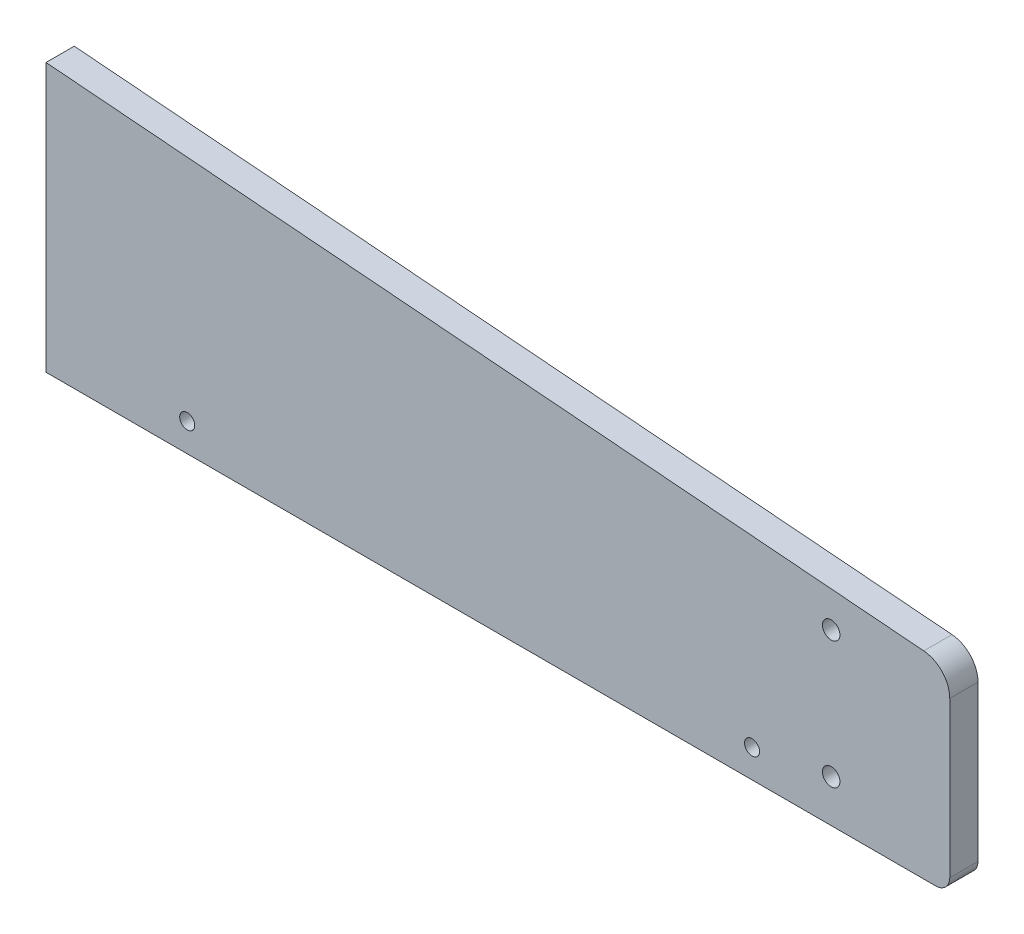
ISO-10303-21;
HEADER;
FILE_DESCRIPTION(('STEP AP214'),'2;1');
FILE_NAME('part.step','',(''),(''),'','','');
FILE_SCHEMA(('AUTOMOTIVE_DESIGN { 1 0 10303 214 1 1 1 1 }'));
ENDSEC;
DATA;
#1=APPLICATION_CONTEXT('core data for automotive mechanical design processes');
#2=APPLICATION_PROTOCOL_DEFINITION('international standard','automotive_design',2000,#1);
#3=PRODUCT_CONTEXT('',#1,'mechanical');
#4=PRODUCT('Part','Part','',(#3));
#5=PRODUCT_RELATED_PRODUCT_CATEGORY('part','',(#4));
#6=PRODUCT_DEFINITION_FORMATION('','',#4);
#7=PRODUCT_DEFINITION_CONTEXT('part definition',#1,'design');
#8=PRODUCT_DEFINITION('design','',#6,#7);
#9=PRODUCT_DEFINITION_SHAPE('','',#8);
#10=(LENGTH_UNIT() NAMED_UNIT(*) SI_UNIT(.MILLI.,.METRE.));
#11=(NAMED_UNIT(*) PLANE_ANGLE_UNIT() SI_UNIT($,.RADIAN.));
#12=(NAMED_UNIT(*) SI_UNIT($,.STERADIAN.) SOLID_ANGLE_UNIT());
#13=UNCERTAINTY_MEASURE_WITH_UNIT(LENGTH_MEASURE(1.E-05),#10,'distance_accuracy_value','');
#14=(GEOMETRIC_REPRESENTATION_CONTEXT(3) GLOBAL_UNCERTAINTY_ASSIGNED_CONTEXT((#13)) GLOBAL_UNIT_ASSIGNED_CONTEXT((#10,
#11,#12)) REPRESENTATION_CONTEXT('',''));
#15=CARTESIAN_POINT('',(0.,0.,0.));
#16=DIRECTION('',(0.,0.,1.));
#17=DIRECTION('',(1.,0.,0.));
#18=AXIS2_PLACEMENT_3D('',#15,#16,#17);
#19=CARTESIAN_POINT('',(469.9,0.,12.7));
#20=DIRECTION('',(0.,1.,0.));
#21=DIRECTION('',(-1.,0.,0.));
#22=AXIS2_PLACEMENT_3D('',#19,#20,#21);
#23=PLANE('',#22);
#24=DIRECTION('',(1.,0.,0.));
#25=VECTOR('',#24,1.);
#26=CARTESIAN_POINT('',(469.9,0.,0.));
#27=LINE('',#26,#25);
#28=CARTESIAN_POINT('',(63.5,0.,0.));
#29=VERTEX_POINT('',#28);
#30=CARTESIAN_POINT('',(463.55,0.,0.));
#31=VERTEX_POINT('',#30);
#32=EDGE_CURVE('E116',#29,#31,#27,.T.);
#33=ORIENTED_EDGE('',*,*,#32,.T.);
#34=DIRECTION('',(0.,0.,-1.));
#35=VECTOR('',#34,1.);
#36=CARTESIAN_POINT('',(463.55,0.,12.7));
#37=LINE('',#36,#35);
#38=CARTESIAN_POINT('',(463.55,0.,12.7));
#39=VERTEX_POINT('',#38);
#40=EDGE_CURVE('E40',#31,#39,#37,.F.);
#41=ORIENTED_EDGE('',*,*,#40,.T.);
#42=DIRECTION('',(1.,0.,0.));
#43=VECTOR('',#42,1.);
#44=CARTESIAN_POINT('',(469.9,0.,12.7));
#45=LINE('',#44,#43);
#46=CARTESIAN_POINT('',(63.5,0.,12.7));
#47=VERTEX_POINT('',#46);
#48=EDGE_CURVE('E94',#47,#39,#45,.T.);
#49=ORIENTED_EDGE('',*,*,#48,.F.);
#50=DIRECTION('',(0.,0.,-1.));
#51=VECTOR('',#50,1.);
#52=CARTESIAN_POINT('',(63.5,0.,12.7));
#53=LINE('',#52,#51);
#54=EDGE_CURVE('E115',#47,#29,#53,.T.);
#55=ORIENTED_EDGE('',*,*,#54,.T.);
#56=EDGE_LOOP('',(#33,#41,#49,#55));
#57=FACE_BOUND('',#56,.T.);
#58=ADVANCED_FACE('F32',(#57),#23,.F.);
#59=CARTESIAN_POINT('',(469.9,76.2,12.7));
#60=DIRECTION('',(-1.,0.,0.));
#61=DIRECTION('',(0.,0.,1.));
#62=AXIS2_PLACEMENT_3D('',#59,#60,#61);
#63=PLANE('',#62);
#64=DIRECTION('',(0.,1.,0.));
#65=VECTOR('',#64,1.);
#66=CARTESIAN_POINT('',(469.9,76.2,12.7));
#67=LINE('',#66,#65);
#68=CARTESIAN_POINT('',(469.9,6.34999999999999,12.7));
#69=VERTEX_POINT('',#68);
#70=CARTESIAN_POINT('',(469.9,76.2,12.7));
#71=VERTEX_POINT('',#70);
#72=EDGE_CURVE('E84',#69,#71,#67,.T.);
#73=ORIENTED_EDGE('',*,*,#72,.F.);
#74=DIRECTION('',(0.,0.,-1.));
#75=VECTOR('',#74,1.);
#76=CARTESIAN_POINT('',(469.9,6.34999999999999,12.7));
#77=LINE('',#76,#75);
#78=CARTESIAN_POINT('',(469.9,6.34999999999999,0.));
#79=VERTEX_POINT('',#78);
#80=EDGE_CURVE('E102',#69,#79,#77,.T.);
#81=ORIENTED_EDGE('',*,*,#80,.T.);
#82=DIRECTION('',(0.,1.,0.));
#83=VECTOR('',#82,1.);
#84=CARTESIAN_POINT('',(469.9,76.2,0.));
#85=LINE('',#84,#83);
#86=CARTESIAN_POINT('',(469.9,76.2,0.));
#87=VERTEX_POINT('',#86);
#88=EDGE_CURVE('E99',#79,#87,#85,.T.);
#89=ORIENTED_EDGE('',*,*,#88,.T.);
#90=DIRECTION('',(0.,0.,-1.));
#91=VECTOR('',#90,1.);
#92=CARTESIAN_POINT('',(469.9,76.2,12.7));
#93=LINE('',#92,#91);
#94=EDGE_CURVE('E97',#71,#87,#93,.T.);
#95=ORIENTED_EDGE('',*,*,#94,.F.);
#96=EDGE_LOOP('',(#73,#81,#89,#95));
#97=FACE_BOUND('',#96,.T.);
#98=ADVANCED_FACE('F98',(#97),#63,.F.);
#99=CARTESIAN_POINT('',(457.2,76.2,12.7));
#100=DIRECTION('',(0.,0.,-1.));
#101=DIRECTION('',(-1.,0.,0.));
#102=AXIS2_PLACEMENT_3D('',#99,#100,#101);
#103=CYLINDRICAL_SURFACE('',#102,12.7);
#104=CARTESIAN_POINT('',(457.2,76.2,0.));
#105=DIRECTION('',(0.,0.,1.));
#106=DIRECTION('',(1.,0.,0.));
#107=AXIS2_PLACEMENT_3D('',#104,#105,#106);
#108=CIRCLE('',#107,12.7);
#109=CARTESIAN_POINT('',(458.21956543178,88.8590081100503,0.));
#110=VERTEX_POINT('',#109);
#111=EDGE_CURVE('E120',#87,#110,#108,.T.);
#112=ORIENTED_EDGE('',*,*,#111,.T.);
#113=DIRECTION('',(0.,0.,-1.));
#114=VECTOR('',#113,1.);
#115=CARTESIAN_POINT('',(458.21956543178,88.8590081100503,12.7));
#116=LINE('',#115,#114);
#117=CARTESIAN_POINT('',(458.21956543178,88.8590081100503,12.7));
#118=VERTEX_POINT('',#117);
#119=EDGE_CURVE('E103',#118,#110,#116,.T.);
#120=ORIENTED_EDGE('',*,*,#119,.F.);
#121=CARTESIAN_POINT('',(457.2,76.2,12.7));
#122=DIRECTION('',(0.,0.,1.));
#123=DIRECTION('',(1.,0.,0.));
#124=AXIS2_PLACEMENT_3D('',#121,#122,#123);
#125=CIRCLE('',#124,12.7);
#126=EDGE_CURVE('E88',#71,#118,#125,.T.);
#127=ORIENTED_EDGE('',*,*,#126,.F.);
#128=ORIENTED_EDGE('',*,*,#94,.T.);
#129=EDGE_LOOP('',(#112,#120,#127,#128));
#130=FACE_BOUND('',#129,.T.);
#131=ADVANCED_FACE('F105',(#130),#103,.T.);
#132=CARTESIAN_POINT('',(63.5,120.65,12.7));
#133=DIRECTION('',(-0.0802807426598325,-0.996772292129946,0.));
#134=DIRECTION('',(0.996772292129946,-0.0802807426598325,0.));
#135=AXIS2_PLACEMENT_3D('',#132,#133,#134);
#136=PLANE('',#135);
#137=DIRECTION('',(-0.996772292129946,0.0802807426598325,0.));
#138=VECTOR('',#137,1.);
#139=CARTESIAN_POINT('',(63.5,120.65,0.));
#140=LINE('',#139,#138);
#141=CARTESIAN_POINT('',(63.5,120.65,0.));
#142=VERTEX_POINT('',#141);
#143=EDGE_CURVE('E122',#110,#142,#140,.T.);
#144=ORIENTED_EDGE('',*,*,#143,.T.);
#145=DIRECTION('',(0.,0.,-1.));
#146=VECTOR('',#145,1.);
#147=CARTESIAN_POINT('',(63.5,120.65,12.7));
#148=LINE('',#147,#146);
#149=CARTESIAN_POINT('',(63.5,120.65,12.7));
#150=VERTEX_POINT('',#149);
#151=EDGE_CURVE('E128',#150,#142,#148,.T.);
#152=ORIENTED_EDGE('',*,*,#151,.F.);
#153=DIRECTION('',(-0.996772292129946,0.0802807426598325,0.));
#154=VECTOR('',#153,1.);
#155=CARTESIAN_POINT('',(63.5,120.65,12.7));
#156=LINE('',#155,#154);
#157=EDGE_CURVE('E108',#118,#150,#156,.T.);
#158=ORIENTED_EDGE('',*,*,#157,.F.);
#159=ORIENTED_EDGE('',*,*,#119,.T.);
#160=EDGE_LOOP('',(#144,#152,#158,#159));
#161=FACE_BOUND('',#160,.T.);
#162=ADVANCED_FACE('F138',(#161),#136,.F.);
#163=CARTESIAN_POINT('',(63.5,0.,12.7));
#164=DIRECTION('',(1.,0.,0.));
#165=DIRECTION('',(0.,0.,-1.));
#166=AXIS2_PLACEMENT_3D('',#163,#164,#165);
#167=PLANE('',#166);
#168=DIRECTION('',(0.,-1.,0.));
#169=VECTOR('',#168,1.);
#170=CARTESIAN_POINT('',(63.5,0.,0.));
#171=LINE('',#170,#169);
#172=EDGE_CURVE('E124',#142,#29,#171,.T.);
#173=ORIENTED_EDGE('',*,*,#172,.T.);
#174=ORIENTED_EDGE('',*,*,#54,.F.);
#175=DIRECTION('',(0.,-1.,0.));
#176=VECTOR('',#175,1.);
#177=CARTESIAN_POINT('',(63.5,0.,12.7));
#178=LINE('',#177,#176);
#179=EDGE_CURVE('E110',#150,#47,#178,.T.);
#180=ORIENTED_EDGE('',*,*,#179,.F.);
#181=ORIENTED_EDGE('',*,*,#151,.T.);
#182=EDGE_LOOP('',(#173,#174,#180,#181));
#183=FACE_BOUND('',#182,.T.);
#184=ADVANCED_FACE('F143',(#183),#167,.F.);
#185=CARTESIAN_POINT('',(457.2,76.2,12.7));
#186=DIRECTION('',(0.,0.,1.));
#187=DIRECTION('',(1.,0.,0.));
#188=AXIS2_PLACEMENT_3D('',#185,#186,#187);
#189=PLANE('',#188);
#190=CARTESIAN_POINT('',(416.56762,76.2,12.7));
#191=DIRECTION('',(0.,0.,-1.));
#192=DIRECTION('',(-1.,0.,0.));
#193=AXIS2_PLACEMENT_3D('',#190,#191,#192);
#194=CIRCLE('',#193,3.937);
#195=CARTESIAN_POINT('',(412.63062,76.2,12.7));
#196=VERTEX_POINT('',#195);
#197=EDGE_CURVE('E149',#196,#196,#194,.T.);
#198=ORIENTED_EDGE('',*,*,#197,.T.);
#199=EDGE_LOOP('',(#198));
#200=FACE_BOUND('',#199,.T.);
#201=CARTESIAN_POINT('',(416.56762,19.0499999999999,12.7));
#202=DIRECTION('',(0.,0.,-1.));
#203=DIRECTION('',(-1.,0.,0.));
#204=AXIS2_PLACEMENT_3D('',#201,#202,#203);
#205=CIRCLE('',#204,3.937);
#206=CARTESIAN_POINT('',(412.63062,19.0499999999999,12.7));
#207=VERTEX_POINT('',#206);
#208=EDGE_CURVE('E160',#207,#207,#205,.T.);
#209=ORIENTED_EDGE('',*,*,#208,.T.);
#210=EDGE_LOOP('',(#209));
#211=FACE_BOUND('',#210,.T.);
#212=CARTESIAN_POINT('',(127.,12.6999999999999,12.7));
#213=DIRECTION('',(0.,0.,1.));
#214=DIRECTION('',(1.,0.,0.));
#215=AXIS2_PLACEMENT_3D('',#212,#213,#214);
#216=CIRCLE('',#215,3.37819999999999);
#217=CARTESIAN_POINT('',(130.3782,12.6999999999999,12.7));
#218=VERTEX_POINT('',#217);
#219=EDGE_CURVE('E152',#218,#218,#216,.T.);
#220=ORIENTED_EDGE('',*,*,#219,.F.);
#221=EDGE_LOOP('',(#220));
#222=FACE_BOUND('',#221,.T.);
#223=CARTESIAN_POINT('',(381.,12.6999999999999,12.7));
#224=DIRECTION('',(0.,0.,1.));
#225=DIRECTION('',(1.,0.,0.));
#226=AXIS2_PLACEMENT_3D('',#223,#224,#225);
#227=CIRCLE('',#226,3.37819999999999);
#228=CARTESIAN_POINT('',(384.3782,12.6999999999999,12.7));
#229=VERTEX_POINT('',#228);
#230=EDGE_CURVE('E145',#229,#229,#227,.T.);
#231=ORIENTED_EDGE('',*,*,#230,.F.);
#232=EDGE_LOOP('',(#231));
#233=FACE_BOUND('',#232,.T.);
#234=ORIENTED_EDGE('',*,*,#48,.T.);
#235=CARTESIAN_POINT('',(463.55,6.34999999999999,12.7));
#236=DIRECTION('',(0.,0.,1.));
#237=DIRECTION('',(1.,0.,0.));
#238=AXIS2_PLACEMENT_3D('',#235,#236,#237);
#239=CIRCLE('',#238,6.35);
#240=EDGE_CURVE('E11',#39,#69,#239,.T.);
#241=ORIENTED_EDGE('',*,*,#240,.T.);
#242=ORIENTED_EDGE('',*,*,#72,.T.);
#243=ORIENTED_EDGE('',*,*,#126,.T.);
#244=ORIENTED_EDGE('',*,*,#157,.T.);
#245=ORIENTED_EDGE('',*,*,#179,.T.);
#246=EDGE_LOOP('',(#234,#241,#242,#243,#244,#245));
#247=FACE_BOUND('',#246,.T.);
#248=ADVANCED_FACE('F86',(#200,#211,#222,#233,#247),#189,.T.);
#249=CARTESIAN_POINT('',(457.2,76.2,0.));
#250=DIRECTION('',(0.,0.,1.));
#251=DIRECTION('',(1.,0.,0.));
#252=AXIS2_PLACEMENT_3D('',#249,#250,#251);
#253=PLANE('',#252);
#254=CARTESIAN_POINT('',(416.56762,76.2,0.));
#255=DIRECTION('',(0.,0.,-1.));
#256=DIRECTION('',(-1.,0.,0.));
#257=AXIS2_PLACEMENT_3D('',#254,#255,#256);
#258=CIRCLE('',#257,3.937);
#259=CARTESIAN_POINT('',(412.63062,76.2,0.));
#260=VERTEX_POINT('',#259);
#261=EDGE_CURVE('E163',#260,#260,#258,.T.);
#262=ORIENTED_EDGE('',*,*,#261,.F.);
#263=EDGE_LOOP('',(#262));
#264=FACE_BOUND('',#263,.T.);
#265=CARTESIAN_POINT('',(416.56762,19.0499999999999,0.));
#266=DIRECTION('',(0.,0.,-1.));
#267=DIRECTION('',(-1.,0.,0.));
#268=AXIS2_PLACEMENT_3D('',#265,#266,#267);
#269=CIRCLE('',#268,3.937);
#270=CARTESIAN_POINT('',(412.63062,19.0499999999999,0.));
#271=VERTEX_POINT('',#270);
#272=EDGE_CURVE('E157',#271,#271,#269,.T.);
#273=ORIENTED_EDGE('',*,*,#272,.F.);
#274=EDGE_LOOP('',(#273));
#275=FACE_BOUND('',#274,.T.);
#276=CARTESIAN_POINT('',(127.,12.6999999999999,0.));
#277=DIRECTION('',(0.,0.,1.));
#278=DIRECTION('',(1.,0.,0.));
#279=AXIS2_PLACEMENT_3D('',#276,#277,#278);
#280=CIRCLE('',#279,3.37819999999999);
#281=CARTESIAN_POINT('',(130.3782,12.6999999999999,0.));
#282=VERTEX_POINT('',#281);
#283=EDGE_CURVE('E118',#282,#282,#280,.T.);
#284=ORIENTED_EDGE('',*,*,#283,.T.);
#285=EDGE_LOOP('',(#284));
#286=FACE_BOUND('',#285,.T.);
#287=CARTESIAN_POINT('',(381.,12.6999999999999,0.));
#288=DIRECTION('',(0.,0.,1.));
#289=DIRECTION('',(1.,0.,0.));
#290=AXIS2_PLACEMENT_3D('',#287,#288,#289);
#291=CIRCLE('',#290,3.37819999999999);
#292=CARTESIAN_POINT('',(384.3782,12.6999999999999,0.));
#293=VERTEX_POINT('',#292);
#294=EDGE_CURVE('E148',#293,#293,#291,.T.);
#295=ORIENTED_EDGE('',*,*,#294,.T.);
#296=EDGE_LOOP('',(#295));
#297=FACE_BOUND('',#296,.T.);
#298=ORIENTED_EDGE('',*,*,#88,.F.);
#299=CARTESIAN_POINT('',(463.55,6.34999999999999,0.));
#300=DIRECTION('',(0.,0.,1.));
#301=DIRECTION('',(1.,0.,0.));
#302=AXIS2_PLACEMENT_3D('',#299,#300,#301);
#303=CIRCLE('',#302,6.35);
#304=EDGE_CURVE('E54',#79,#31,#303,.F.);
#305=ORIENTED_EDGE('',*,*,#304,.T.);
#306=ORIENTED_EDGE('',*,*,#32,.F.);
#307=ORIENTED_EDGE('',*,*,#172,.F.);
#308=ORIENTED_EDGE('',*,*,#143,.F.);
#309=ORIENTED_EDGE('',*,*,#111,.F.);
#310=EDGE_LOOP('',(#298,#305,#306,#307,#308,#309));
#311=FACE_BOUND('',#310,.T.);
#312=ADVANCED_FACE('F134',(#264,#275,#286,#297,#311),#253,.F.);
#313=CARTESIAN_POINT('',(381.,12.6999999999999,0.));
#314=DIRECTION('',(0.,0.,1.));
#315=DIRECTION('',(1.,0.,0.));
#316=AXIS2_PLACEMENT_3D('',#313,#314,#315);
#317=CYLINDRICAL_SURFACE('',#316,3.37819999999999);
#318=ORIENTED_EDGE('',*,*,#294,.F.);
#319=EDGE_LOOP('',(#318));
#320=FACE_BOUND('',#319,.T.);
#321=ORIENTED_EDGE('',*,*,#230,.T.);
#322=EDGE_LOOP('',(#321));
#323=FACE_BOUND('',#322,.T.);
#324=ADVANCED_FACE('F180',(#320,#323),#317,.F.);
#325=CARTESIAN_POINT('',(127.,12.6999999999999,0.));
#326=DIRECTION('',(0.,0.,1.));
#327=DIRECTION('',(1.,0.,0.));
#328=AXIS2_PLACEMENT_3D('',#325,#326,#327);
#329=CYLINDRICAL_SURFACE('',#328,3.37819999999999);
#330=ORIENTED_EDGE('',*,*,#283,.F.);
#331=EDGE_LOOP('',(#330));
#332=FACE_BOUND('',#331,.T.);
#333=ORIENTED_EDGE('',*,*,#219,.T.);
#334=EDGE_LOOP('',(#333));
#335=FACE_BOUND('',#334,.T.);
#336=ADVANCED_FACE('F190',(#332,#335),#329,.F.);
#337=CARTESIAN_POINT('',(463.55,6.34999999999999,12.7));
#338=DIRECTION('',(0.,0.,-1.));
#339=DIRECTION('',(-1.,0.,0.));
#340=AXIS2_PLACEMENT_3D('',#337,#338,#339);
#341=CYLINDRICAL_SURFACE('',#340,6.35);
#342=ORIENTED_EDGE('',*,*,#240,.F.);
#343=ORIENTED_EDGE('',*,*,#40,.F.);
#344=ORIENTED_EDGE('',*,*,#304,.F.);
#345=ORIENTED_EDGE('',*,*,#80,.F.);
#346=EDGE_LOOP('',(#342,#343,#344,#345));
#347=FACE_BOUND('',#346,.T.);
#348=ADVANCED_FACE('F34',(#347),#341,.T.);
#349=CARTESIAN_POINT('',(416.56762,19.0499999999999,12.7));
#350=DIRECTION('',(0.,0.,-1.));
#351=DIRECTION('',(-1.,0.,0.));
#352=AXIS2_PLACEMENT_3D('',#349,#350,#351);
#353=CYLINDRICAL_SURFACE('',#352,3.937);
#354=ORIENTED_EDGE('',*,*,#208,.F.);
#355=EDGE_LOOP('',(#354));
#356=FACE_BOUND('',#355,.T.);
#357=ORIENTED_EDGE('',*,*,#272,.T.);
#358=EDGE_LOOP('',(#357));
#359=FACE_BOUND('',#358,.T.);
#360=ADVANCED_FACE('F174',(#356,#359),#353,.F.);
#361=CARTESIAN_POINT('',(416.56762,76.2,12.7));
#362=DIRECTION('',(0.,0.,-1.));
#363=DIRECTION('',(-1.,0.,0.));
#364=AXIS2_PLACEMENT_3D('',#361,#362,#363);
#365=CYLINDRICAL_SURFACE('',#364,3.937);
#366=ORIENTED_EDGE('',*,*,#197,.F.);
#367=EDGE_LOOP('',(#366));
#368=FACE_BOUND('',#367,.T.);
#369=ORIENTED_EDGE('',*,*,#261,.T.);
#370=EDGE_LOOP('',(#369));
#371=FACE_BOUND('',#370,.T.);
#372=ADVANCED_FACE('F171',(#368,#371),#365,.F.);
#373=CLOSED_SHELL('',(#58,#98,#131,#162,#184,#248,#312,#324,#336,#348,#360,#372));
#374=MANIFOLD_SOLID_BREP('B2',#373);
#375=ADVANCED_BREP_SHAPE_REPRESENTATION('',(#18,#374),#14);
#376=SHAPE_DEFINITION_REPRESENTATION(#9,#375);
ENDSEC;
END-ISO-10303-21;
